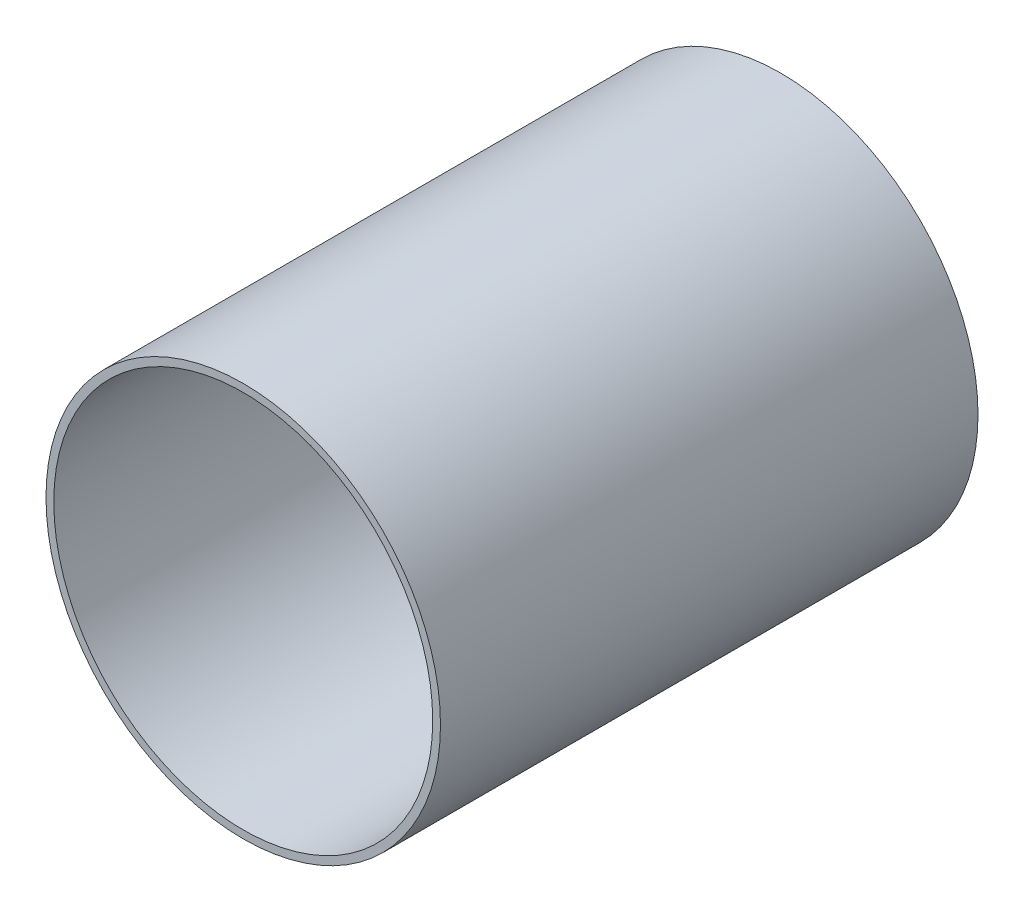
ISO-10303-21;
HEADER;
FILE_DESCRIPTION(('STEP AP214'),'2;1');
FILE_NAME('part.step','',(''),(''),'','','');
FILE_SCHEMA(('AUTOMOTIVE_DESIGN { 1 0 10303 214 1 1 1 1 }'));
ENDSEC;
DATA;
#1=APPLICATION_CONTEXT('core data for automotive mechanical design processes');
#2=APPLICATION_PROTOCOL_DEFINITION('international standard','automotive_design',2000,#1);
#3=PRODUCT_CONTEXT('',#1,'mechanical');
#4=PRODUCT('Part','Part','',(#3));
#5=PRODUCT_RELATED_PRODUCT_CATEGORY('part','',(#4));
#6=PRODUCT_DEFINITION_FORMATION('','',#4);
#7=PRODUCT_DEFINITION_CONTEXT('part definition',#1,'design');
#8=PRODUCT_DEFINITION('design','',#6,#7);
#9=PRODUCT_DEFINITION_SHAPE('','',#8);
#10=(LENGTH_UNIT() NAMED_UNIT(*) SI_UNIT(.MILLI.,.METRE.));
#11=(NAMED_UNIT(*) PLANE_ANGLE_UNIT() SI_UNIT($,.RADIAN.));
#12=(NAMED_UNIT(*) SI_UNIT($,.STERADIAN.) SOLID_ANGLE_UNIT());
#13=UNCERTAINTY_MEASURE_WITH_UNIT(LENGTH_MEASURE(1.E-05),#10,'distance_accuracy_value','');
#14=(GEOMETRIC_REPRESENTATION_CONTEXT(3) GLOBAL_UNCERTAINTY_ASSIGNED_CONTEXT((#13)) GLOBAL_UNIT_ASSIGNED_CONTEXT((#10,
#11,#12)) REPRESENTATION_CONTEXT('',''));
#15=CARTESIAN_POINT('',(0.,0.,0.));
#16=DIRECTION('',(0.,0.,1.));
#17=DIRECTION('',(1.,0.,0.));
#18=AXIS2_PLACEMENT_3D('',#15,#16,#17);
#19=CARTESIAN_POINT('',(0.,0.,30.25));
#20=DIRECTION('',(0.,0.,1.));
#21=DIRECTION('',(1.,0.,0.));
#22=AXIS2_PLACEMENT_3D('',#19,#20,#21);
#23=PLANE('',#22);
#24=CARTESIAN_POINT('',(0.,0.,30.25));
#25=DIRECTION('',(0.,0.,1.));
#26=DIRECTION('',(1.,0.,0.));
#27=AXIS2_PLACEMENT_3D('',#24,#25,#26);
#28=CIRCLE('',#27,22.2);
#29=CARTESIAN_POINT('',(22.2,0.,30.25));
#30=VERTEX_POINT('',#29);
#31=EDGE_CURVE('E10',#30,#30,#28,.T.);
#32=ORIENTED_EDGE('',*,*,#31,.T.);
#33=EDGE_LOOP('',(#32));
#34=FACE_BOUND('',#33,.T.);
#35=CARTESIAN_POINT('',(0.,0.,30.25));
#36=DIRECTION('',(0.,0.,1.));
#37=DIRECTION('',(1.,0.,0.));
#38=AXIS2_PLACEMENT_3D('',#35,#36,#37);
#39=CIRCLE('',#38,21.325);
#40=CARTESIAN_POINT('',(21.325,0.,30.25));
#41=VERTEX_POINT('',#40);
#42=EDGE_CURVE('E42',#41,#41,#39,.T.);
#43=ORIENTED_EDGE('',*,*,#42,.F.);
#44=EDGE_LOOP('',(#43));
#45=FACE_BOUND('',#44,.T.);
#46=ADVANCED_FACE('F31',(#34,#45),#23,.T.);
#47=CARTESIAN_POINT('',(0.,0.,-30.25));
#48=DIRECTION('',(0.,0.,1.));
#49=DIRECTION('',(1.,0.,0.));
#50=AXIS2_PLACEMENT_3D('',#47,#48,#49);
#51=PLANE('',#50);
#52=CARTESIAN_POINT('',(0.,0.,-30.25));
#53=DIRECTION('',(0.,0.,1.));
#54=DIRECTION('',(1.,0.,0.));
#55=AXIS2_PLACEMENT_3D('',#52,#53,#54);
#56=CIRCLE('',#55,22.2);
#57=CARTESIAN_POINT('',(22.2,0.,-30.25));
#58=VERTEX_POINT('',#57);
#59=EDGE_CURVE('E35',#58,#58,#56,.T.);
#60=ORIENTED_EDGE('',*,*,#59,.F.);
#61=EDGE_LOOP('',(#60));
#62=FACE_BOUND('',#61,.T.);
#63=CARTESIAN_POINT('',(0.,0.,-30.25));
#64=DIRECTION('',(0.,0.,1.));
#65=DIRECTION('',(1.,0.,0.));
#66=AXIS2_PLACEMENT_3D('',#63,#64,#65);
#67=CIRCLE('',#66,21.325);
#68=CARTESIAN_POINT('',(21.325,0.,-30.25));
#69=VERTEX_POINT('',#68);
#70=EDGE_CURVE('E44',#69,#69,#67,.T.);
#71=ORIENTED_EDGE('',*,*,#70,.T.);
#72=EDGE_LOOP('',(#71));
#73=FACE_BOUND('',#72,.T.);
#74=ADVANCED_FACE('F54',(#62,#73),#51,.F.);
#75=CARTESIAN_POINT('',(0.,0.,30.25));
#76=DIRECTION('',(0.,0.,-1.));
#77=DIRECTION('',(-1.,0.,0.));
#78=AXIS2_PLACEMENT_3D('',#75,#76,#77);
#79=CYLINDRICAL_SURFACE('',#78,22.2);
#80=ORIENTED_EDGE('',*,*,#31,.F.);
#81=EDGE_LOOP('',(#80));
#82=FACE_BOUND('',#81,.T.);
#83=ORIENTED_EDGE('',*,*,#59,.T.);
#84=EDGE_LOOP('',(#83));
#85=FACE_BOUND('',#84,.T.);
#86=ADVANCED_FACE('F33',(#82,#85),#79,.T.);
#87=CARTESIAN_POINT('',(0.,0.,30.25));
#88=DIRECTION('',(0.,0.,-1.));
#89=DIRECTION('',(-1.,0.,0.));
#90=AXIS2_PLACEMENT_3D('',#87,#88,#89);
#91=CYLINDRICAL_SURFACE('',#90,21.325);
#92=ORIENTED_EDGE('',*,*,#42,.T.);
#93=EDGE_LOOP('',(#92));
#94=FACE_BOUND('',#93,.T.);
#95=ORIENTED_EDGE('',*,*,#70,.F.);
#96=EDGE_LOOP('',(#95));
#97=FACE_BOUND('',#96,.T.);
#98=ADVANCED_FACE('F50',(#94,#97),#91,.F.);
#99=CLOSED_SHELL('',(#46,#74,#86,#98));
#100=MANIFOLD_SOLID_BREP('B2',#99);
#101=ADVANCED_BREP_SHAPE_REPRESENTATION('',(#18,#100),#14);
#102=SHAPE_DEFINITION_REPRESENTATION(#9,#101);
ENDSEC;
END-ISO-10303-21;
